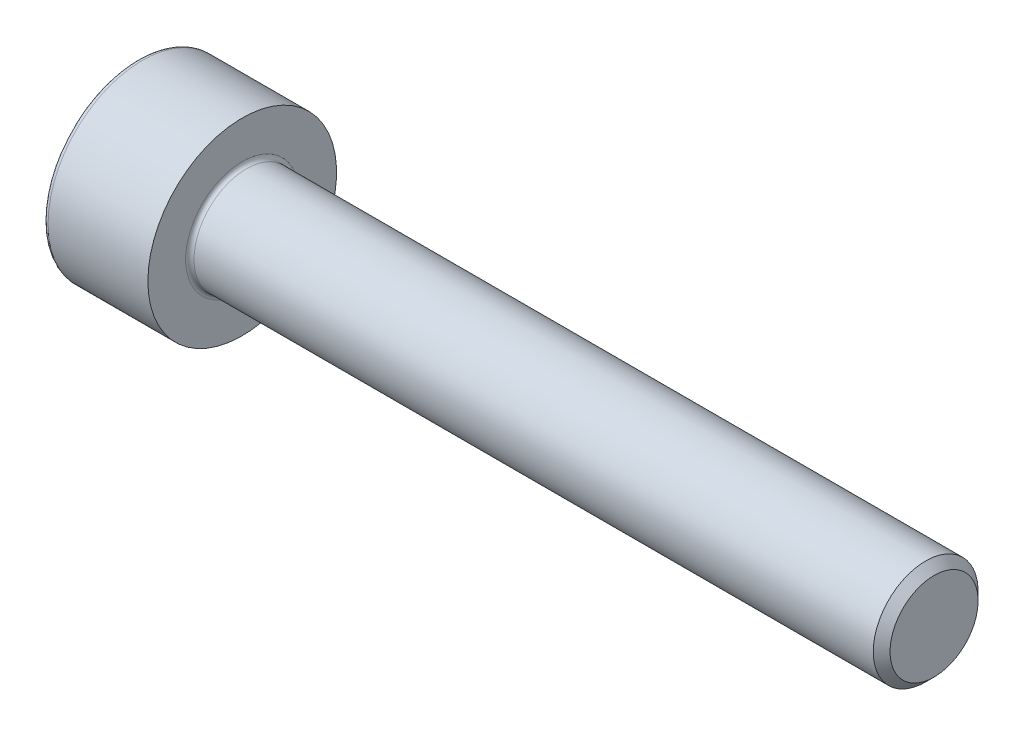
ISO-10303-21;
HEADER;
FILE_DESCRIPTION(('STEP AP214'),'2;1');
FILE_NAME('part.step','',(''),(''),'','','');
FILE_SCHEMA(('AUTOMOTIVE_DESIGN { 1 0 10303 214 1 1 1 1 }'));
ENDSEC;
DATA;
#1=APPLICATION_CONTEXT('core data for automotive mechanical design processes');
#2=APPLICATION_PROTOCOL_DEFINITION('international standard','automotive_design',2000,#1);
#3=PRODUCT_CONTEXT('',#1,'mechanical');
#4=PRODUCT('Part','Part','',(#3));
#5=PRODUCT_RELATED_PRODUCT_CATEGORY('part','',(#4));
#6=PRODUCT_DEFINITION_FORMATION('','',#4);
#7=PRODUCT_DEFINITION_CONTEXT('part definition',#1,'design');
#8=PRODUCT_DEFINITION('design','',#6,#7);
#9=PRODUCT_DEFINITION_SHAPE('','',#8);
#10=(LENGTH_UNIT() NAMED_UNIT(*) SI_UNIT(.MILLI.,.METRE.));
#11=(NAMED_UNIT(*) PLANE_ANGLE_UNIT() SI_UNIT($,.RADIAN.));
#12=(NAMED_UNIT(*) SI_UNIT($,.STERADIAN.) SOLID_ANGLE_UNIT());
#13=UNCERTAINTY_MEASURE_WITH_UNIT(LENGTH_MEASURE(1.E-05),#10,'distance_accuracy_value','');
#14=(GEOMETRIC_REPRESENTATION_CONTEXT(3) GLOBAL_UNCERTAINTY_ASSIGNED_CONTEXT((#13)) GLOBAL_UNIT_ASSIGNED_CONTEXT((#10,
#11,#12)) REPRESENTATION_CONTEXT('',''));
#15=CARTESIAN_POINT('',(0.,0.,0.));
#16=DIRECTION('',(0.,0.,1.));
#17=DIRECTION('',(1.,0.,0.));
#18=AXIS2_PLACEMENT_3D('',#15,#16,#17);
#19=CARTESIAN_POINT('',(19.,0.,0.));
#20=DIRECTION('',(-1.,0.,0.));
#21=DIRECTION('',(0.,0.,1.));
#22=AXIS2_PLACEMENT_3D('',#19,#20,#21);
#23=PLANE('',#22);
#24=CARTESIAN_POINT('',(19.,0.,0.));
#25=DIRECTION('',(-1.,0.,0.));
#26=DIRECTION('',(0.,0.,1.));
#27=AXIS2_PLACEMENT_3D('',#24,#25,#26);
#28=CIRCLE('',#27,1.05);
#29=CARTESIAN_POINT('',(19.,0.,1.05));
#30=VERTEX_POINT('',#29);
#31=EDGE_CURVE('E11',#30,#30,#28,.F.);
#32=ORIENTED_EDGE('',*,*,#31,.T.);
#33=EDGE_LOOP('',(#32));
#34=FACE_BOUND('',#33,.T.);
#35=ADVANCED_FACE('F37',(#34),#23,.F.);
#36=CARTESIAN_POINT('',(0.,0.,0.));
#37=DIRECTION('',(-1.,0.,0.));
#38=DIRECTION('',(0.,0.,1.));
#39=AXIS2_PLACEMENT_3D('',#36,#37,#38);
#40=CYLINDRICAL_SURFACE('',#39,1.25);
#41=CARTESIAN_POINT('',(18.8,0.,0.));
#42=DIRECTION('',(-1.,0.,0.));
#43=DIRECTION('',(0.,0.,1.));
#44=AXIS2_PLACEMENT_3D('',#41,#42,#43);
#45=CIRCLE('',#44,1.25);
#46=CARTESIAN_POINT('',(18.8,0.,1.25));
#47=VERTEX_POINT('',#46);
#48=EDGE_CURVE('E45',#47,#47,#45,.T.);
#49=ORIENTED_EDGE('',*,*,#48,.T.);
#50=EDGE_LOOP('',(#49));
#51=FACE_BOUND('',#50,.T.);
#52=CARTESIAN_POINT('',(2.6,0.,0.));
#53=DIRECTION('',(1.,0.,0.));
#54=DIRECTION('',(0.,0.,-1.));
#55=AXIS2_PLACEMENT_3D('',#52,#53,#54);
#56=CIRCLE('',#55,1.25);
#57=CARTESIAN_POINT('',(2.6,0.,-1.25));
#58=VERTEX_POINT('',#57);
#59=EDGE_CURVE('E150',#58,#58,#56,.T.);
#60=ORIENTED_EDGE('',*,*,#59,.T.);
#61=EDGE_LOOP('',(#60));
#62=FACE_BOUND('',#61,.T.);
#63=ADVANCED_FACE('F161',(#51,#62),#40,.T.);
#64=CARTESIAN_POINT('',(2.5,0.,0.));
#65=DIRECTION('',(1.,0.,0.));
#66=DIRECTION('',(0.,0.,-1.));
#67=AXIS2_PLACEMENT_3D('',#64,#65,#66);
#68=PLANE('',#67);
#69=CARTESIAN_POINT('',(2.5,0.,0.));
#70=DIRECTION('',(1.,0.,0.));
#71=DIRECTION('',(0.,0.,-1.));
#72=AXIS2_PLACEMENT_3D('',#69,#70,#71);
#73=CIRCLE('',#72,1.35);
#74=CARTESIAN_POINT('',(2.5,0.,-1.35));
#75=VERTEX_POINT('',#74);
#76=EDGE_CURVE('E147',#75,#75,#73,.F.);
#77=ORIENTED_EDGE('',*,*,#76,.T.);
#78=EDGE_LOOP('',(#77));
#79=FACE_BOUND('',#78,.T.);
#80=CARTESIAN_POINT('',(2.5,0.,0.));
#81=DIRECTION('',(-1.,0.,0.));
#82=DIRECTION('',(0.,0.,1.));
#83=AXIS2_PLACEMENT_3D('',#80,#81,#82);
#84=CIRCLE('',#83,2.25);
#85=CARTESIAN_POINT('',(2.5,0.,2.25));
#86=VERTEX_POINT('',#85);
#87=EDGE_CURVE('E139',#86,#86,#84,.T.);
#88=ORIENTED_EDGE('',*,*,#87,.F.);
#89=EDGE_LOOP('',(#88));
#90=FACE_BOUND('',#89,.T.);
#91=ADVANCED_FACE('F183',(#79,#90),#68,.T.);
#92=CARTESIAN_POINT('',(0.,0.,0.));
#93=DIRECTION('',(-1.,0.,0.));
#94=DIRECTION('',(0.,0.,1.));
#95=AXIS2_PLACEMENT_3D('',#92,#93,#94);
#96=CYLINDRICAL_SURFACE('',#95,2.25);
#97=CARTESIAN_POINT('',(0.12,0.,0.));
#98=DIRECTION('',(-1.,0.,0.));
#99=DIRECTION('',(0.,0.,1.));
#100=AXIS2_PLACEMENT_3D('',#97,#98,#99);
#101=CIRCLE('',#100,2.25);
#102=CARTESIAN_POINT('',(0.12,0.,2.25));
#103=VERTEX_POINT('',#102);
#104=EDGE_CURVE('E156',#103,#103,#101,.F.);
#105=ORIENTED_EDGE('',*,*,#104,.T.);
#106=EDGE_LOOP('',(#105));
#107=FACE_BOUND('',#106,.T.);
#108=ORIENTED_EDGE('',*,*,#87,.T.);
#109=EDGE_LOOP('',(#108));
#110=FACE_BOUND('',#109,.T.);
#111=ADVANCED_FACE('F193',(#107,#110),#96,.T.);
#112=CARTESIAN_POINT('',(0.,0.,0.));
#113=DIRECTION('',(-1.,0.,0.));
#114=DIRECTION('',(0.,0.,1.));
#115=AXIS2_PLACEMENT_3D('',#112,#113,#114);
#116=PLANE('',#115);
#117=DIRECTION('',(0.,0.5,-0.866025403784439));
#118=VECTOR('',#117,1.);
#119=CARTESIAN_POINT('',(0.,0.577350269189626,1.));
#120=LINE('',#119,#118);
#121=CARTESIAN_POINT('',(0.,0.577350269189626,1.));
#122=VERTEX_POINT('',#121);
#123=CARTESIAN_POINT('',(0.,1.15470053837925,0.));
#124=VERTEX_POINT('',#123);
#125=EDGE_CURVE('E52',#122,#124,#120,.T.);
#126=ORIENTED_EDGE('',*,*,#125,.F.);
#127=DIRECTION('',(0.,1.,0.));
#128=VECTOR('',#127,1.);
#129=CARTESIAN_POINT('',(0.,-0.577350269189626,1.));
#130=LINE('',#129,#128);
#131=CARTESIAN_POINT('',(0.,-0.577350269189626,1.));
#132=VERTEX_POINT('',#131);
#133=EDGE_CURVE('E135',#132,#122,#130,.T.);
#134=ORIENTED_EDGE('',*,*,#133,.F.);
#135=DIRECTION('',(0.,0.5,0.866025403784439));
#136=VECTOR('',#135,1.);
#137=CARTESIAN_POINT('',(0.,-1.15470053837925,0.));
#138=LINE('',#137,#136);
#139=CARTESIAN_POINT('',(0.,-1.15470053837925,0.));
#140=VERTEX_POINT('',#139);
#141=EDGE_CURVE('E133',#140,#132,#138,.T.);
#142=ORIENTED_EDGE('',*,*,#141,.F.);
#143=DIRECTION('',(0.,-0.5,0.866025403784439));
#144=VECTOR('',#143,1.);
#145=CARTESIAN_POINT('',(0.,-0.577350269189626,-1.));
#146=LINE('',#145,#144);
#147=CARTESIAN_POINT('',(0.,-0.577350269189626,-1.));
#148=VERTEX_POINT('',#147);
#149=EDGE_CURVE('E100',#148,#140,#146,.T.);
#150=ORIENTED_EDGE('',*,*,#149,.F.);
#151=DIRECTION('',(0.,-1.,0.));
#152=VECTOR('',#151,1.);
#153=CARTESIAN_POINT('',(0.,0.577350269189626,-1.));
#154=LINE('',#153,#152);
#155=CARTESIAN_POINT('',(0.,0.577350269189626,-1.));
#156=VERTEX_POINT('',#155);
#157=EDGE_CURVE('E129',#156,#148,#154,.T.);
#158=ORIENTED_EDGE('',*,*,#157,.F.);
#159=DIRECTION('',(0.,-0.5,-0.866025403784439));
#160=VECTOR('',#159,1.);
#161=CARTESIAN_POINT('',(0.,1.15470053837925,0.));
#162=LINE('',#161,#160);
#163=EDGE_CURVE('E126',#124,#156,#162,.T.);
#164=ORIENTED_EDGE('',*,*,#163,.F.);
#165=EDGE_LOOP('',(#126,#134,#142,#150,#158,#164));
#166=FACE_BOUND('',#165,.T.);
#167=CARTESIAN_POINT('',(0.,0.,0.));
#168=DIRECTION('',(-1.,0.,0.));
#169=DIRECTION('',(0.,0.,1.));
#170=AXIS2_PLACEMENT_3D('',#167,#168,#169);
#171=CIRCLE('',#170,2.13);
#172=CARTESIAN_POINT('',(0.,0.,2.13));
#173=VERTEX_POINT('',#172);
#174=EDGE_CURVE('E153',#173,#173,#171,.T.);
#175=ORIENTED_EDGE('',*,*,#174,.T.);
#176=EDGE_LOOP('',(#175));
#177=FACE_BOUND('',#176,.T.);
#178=ADVANCED_FACE('F188',(#166,#177),#116,.T.);
#179=CARTESIAN_POINT('',(2.6,0.,0.));
#180=DIRECTION('',(1.,0.,0.));
#181=DIRECTION('',(0.,0.,-1.));
#182=AXIS2_PLACEMENT_3D('',#179,#180,#181);
#183=TOROIDAL_SURFACE('',#182,1.35,0.1);
#184=ORIENTED_EDGE('',*,*,#59,.F.);
#185=EDGE_LOOP('',(#184));
#186=FACE_BOUND('',#185,.T.);
#187=ORIENTED_EDGE('',*,*,#76,.F.);
#188=EDGE_LOOP('',(#187));
#189=FACE_BOUND('',#188,.T.);
#190=ADVANCED_FACE('F174',(#186,#189),#183,.F.);
#191=CARTESIAN_POINT('',(0.12,0.,0.));
#192=DIRECTION('',(-1.,0.,0.));
#193=DIRECTION('',(0.,0.,1.));
#194=AXIS2_PLACEMENT_3D('',#191,#192,#193);
#195=TOROIDAL_SURFACE('',#194,2.13,0.12);
#196=ORIENTED_EDGE('',*,*,#104,.F.);
#197=EDGE_LOOP('',(#196));
#198=FACE_BOUND('',#197,.T.);
#199=ORIENTED_EDGE('',*,*,#174,.F.);
#200=EDGE_LOOP('',(#199));
#201=FACE_BOUND('',#200,.T.);
#202=ADVANCED_FACE('F166',(#198,#201),#195,.T.);
#203=CARTESIAN_POINT('',(18.8,0.,0.));
#204=DIRECTION('',(-1.,0.,0.));
#205=DIRECTION('',(0.,0.,1.));
#206=AXIS2_PLACEMENT_3D('',#203,#204,#205);
#207=CONICAL_SURFACE('',#206,1.25,0.785398163397456);
#208=ORIENTED_EDGE('',*,*,#31,.F.);
#209=EDGE_LOOP('',(#208));
#210=FACE_BOUND('',#209,.T.);
#211=ORIENTED_EDGE('',*,*,#48,.F.);
#212=EDGE_LOOP('',(#211));
#213=FACE_BOUND('',#212,.T.);
#214=ADVANCED_FACE('F39',(#210,#213),#207,.T.);
#215=CARTESIAN_POINT('',(1.,0.577350269189626,1.));
#216=DIRECTION('',(0.,0.866025403784439,0.5));
#217=DIRECTION('',(0.,-0.5,0.866025403784439));
#218=AXIS2_PLACEMENT_3D('',#215,#216,#217);
#219=PLANE('',#218);
#220=ORIENTED_EDGE('',*,*,#125,.T.);
#221=DIRECTION('',(-1.,0.,0.));
#222=VECTOR('',#221,1.);
#223=CARTESIAN_POINT('',(1.,1.15470053837925,0.));
#224=LINE('',#223,#222);
#225=CARTESIAN_POINT('',(1.,1.15470053837925,0.));
#226=VERTEX_POINT('',#225);
#227=EDGE_CURVE('E82',#226,#124,#224,.T.);
#228=ORIENTED_EDGE('',*,*,#227,.F.);
#229=DIRECTION('',(0.,0.5,-0.866025403784439));
#230=VECTOR('',#229,1.);
#231=CARTESIAN_POINT('',(1.,0.577350269189626,1.));
#232=LINE('',#231,#230);
#233=CARTESIAN_POINT('',(1.,0.577350269189626,1.));
#234=VERTEX_POINT('',#233);
#235=EDGE_CURVE('E137',#234,#226,#232,.T.);
#236=ORIENTED_EDGE('',*,*,#235,.F.);
#237=DIRECTION('',(-1.,0.,0.));
#238=VECTOR('',#237,1.);
#239=CARTESIAN_POINT('',(1.,0.577350269189626,1.));
#240=LINE('',#239,#238);
#241=EDGE_CURVE('E60',#234,#122,#240,.T.);
#242=ORIENTED_EDGE('',*,*,#241,.T.);
#243=EDGE_LOOP('',(#220,#228,#236,#242));
#244=FACE_BOUND('',#243,.T.);
#245=ADVANCED_FACE('F165',(#244),#219,.F.);
#246=CARTESIAN_POINT('',(1.,-0.577350269189626,1.));
#247=DIRECTION('',(0.,0.,1.));
#248=DIRECTION('',(0.,-1.,0.));
#249=AXIS2_PLACEMENT_3D('',#246,#247,#248);
#250=PLANE('',#249);
#251=ORIENTED_EDGE('',*,*,#133,.T.);
#252=ORIENTED_EDGE('',*,*,#241,.F.);
#253=DIRECTION('',(0.,1.,0.));
#254=VECTOR('',#253,1.);
#255=CARTESIAN_POINT('',(1.,-0.577350269189626,1.));
#256=LINE('',#255,#254);
#257=CARTESIAN_POINT('',(1.,-0.577350269189626,1.));
#258=VERTEX_POINT('',#257);
#259=EDGE_CURVE('E112',#258,#234,#256,.T.);
#260=ORIENTED_EDGE('',*,*,#259,.F.);
#261=DIRECTION('',(-1.,0.,0.));
#262=VECTOR('',#261,1.);
#263=CARTESIAN_POINT('',(1.,-0.577350269189626,1.));
#264=LINE('',#263,#262);
#265=EDGE_CURVE('E104',#258,#132,#264,.T.);
#266=ORIENTED_EDGE('',*,*,#265,.T.);
#267=EDGE_LOOP('',(#251,#252,#260,#266));
#268=FACE_BOUND('',#267,.T.);
#269=ADVANCED_FACE('F172',(#268),#250,.F.);
#270=CARTESIAN_POINT('',(1.,-1.15470053837925,0.));
#271=DIRECTION('',(0.,-0.866025403784439,0.5));
#272=DIRECTION('',(0.,-0.5,-0.866025403784439));
#273=AXIS2_PLACEMENT_3D('',#270,#271,#272);
#274=PLANE('',#273);
#275=ORIENTED_EDGE('',*,*,#141,.T.);
#276=ORIENTED_EDGE('',*,*,#265,.F.);
#277=DIRECTION('',(0.,0.5,0.866025403784439));
#278=VECTOR('',#277,1.);
#279=CARTESIAN_POINT('',(1.,-1.15470053837925,0.));
#280=LINE('',#279,#278);
#281=CARTESIAN_POINT('',(1.,-1.15470053837925,0.));
#282=VERTEX_POINT('',#281);
#283=EDGE_CURVE('E108',#282,#258,#280,.T.);
#284=ORIENTED_EDGE('',*,*,#283,.F.);
#285=DIRECTION('',(-1.,0.,0.));
#286=VECTOR('',#285,1.);
#287=CARTESIAN_POINT('',(1.,-1.15470053837925,0.));
#288=LINE('',#287,#286);
#289=EDGE_CURVE('E93',#282,#140,#288,.T.);
#290=ORIENTED_EDGE('',*,*,#289,.T.);
#291=EDGE_LOOP('',(#275,#276,#284,#290));
#292=FACE_BOUND('',#291,.T.);
#293=ADVANCED_FACE('F109',(#292),#274,.F.);
#294=CARTESIAN_POINT('',(1.,-0.577350269189626,-1.));
#295=DIRECTION('',(0.,-0.866025403784439,-0.5));
#296=DIRECTION('',(0.,0.5,-0.866025403784439));
#297=AXIS2_PLACEMENT_3D('',#294,#295,#296);
#298=PLANE('',#297);
#299=ORIENTED_EDGE('',*,*,#149,.T.);
#300=ORIENTED_EDGE('',*,*,#289,.F.);
#301=DIRECTION('',(0.,-0.5,0.866025403784439));
#302=VECTOR('',#301,1.);
#303=CARTESIAN_POINT('',(1.,-0.577350269189626,-1.));
#304=LINE('',#303,#302);
#305=CARTESIAN_POINT('',(1.,-0.577350269189626,-1.));
#306=VERTEX_POINT('',#305);
#307=EDGE_CURVE('E97',#306,#282,#304,.T.);
#308=ORIENTED_EDGE('',*,*,#307,.F.);
#309=DIRECTION('',(-1.,0.,0.));
#310=VECTOR('',#309,1.);
#311=CARTESIAN_POINT('',(1.,-0.577350269189626,-1.));
#312=LINE('',#311,#310);
#313=EDGE_CURVE('E105',#306,#148,#312,.T.);
#314=ORIENTED_EDGE('',*,*,#313,.T.);
#315=EDGE_LOOP('',(#299,#300,#308,#314));
#316=FACE_BOUND('',#315,.T.);
#317=ADVANCED_FACE('F95',(#316),#298,.F.);
#318=CARTESIAN_POINT('',(1.,0.577350269189626,-1.));
#319=DIRECTION('',(0.,0.,-1.));
#320=DIRECTION('',(0.,1.,0.));
#321=AXIS2_PLACEMENT_3D('',#318,#319,#320);
#322=PLANE('',#321);
#323=ORIENTED_EDGE('',*,*,#157,.T.);
#324=ORIENTED_EDGE('',*,*,#313,.F.);
#325=DIRECTION('',(0.,-1.,0.));
#326=VECTOR('',#325,1.);
#327=CARTESIAN_POINT('',(1.,0.577350269189626,-1.));
#328=LINE('',#327,#326);
#329=CARTESIAN_POINT('',(1.,0.577350269189626,-1.));
#330=VERTEX_POINT('',#329);
#331=EDGE_CURVE('E118',#330,#306,#328,.T.);
#332=ORIENTED_EDGE('',*,*,#331,.F.);
#333=DIRECTION('',(-1.,0.,0.));
#334=VECTOR('',#333,1.);
#335=CARTESIAN_POINT('',(1.,0.577350269189626,-1.));
#336=LINE('',#335,#334);
#337=EDGE_CURVE('E142',#330,#156,#336,.T.);
#338=ORIENTED_EDGE('',*,*,#337,.T.);
#339=EDGE_LOOP('',(#323,#324,#332,#338));
#340=FACE_BOUND('',#339,.T.);
#341=ADVANCED_FACE('F213',(#340),#322,.F.);
#342=CARTESIAN_POINT('',(1.,1.15470053837925,0.));
#343=DIRECTION('',(0.,0.866025403784439,-0.5));
#344=DIRECTION('',(0.,0.5,0.866025403784439));
#345=AXIS2_PLACEMENT_3D('',#342,#343,#344);
#346=PLANE('',#345);
#347=ORIENTED_EDGE('',*,*,#163,.T.);
#348=ORIENTED_EDGE('',*,*,#337,.F.);
#349=DIRECTION('',(0.,-0.5,-0.866025403784439));
#350=VECTOR('',#349,1.);
#351=CARTESIAN_POINT('',(1.,1.15470053837925,0.));
#352=LINE('',#351,#350);
#353=EDGE_CURVE('E120',#226,#330,#352,.T.);
#354=ORIENTED_EDGE('',*,*,#353,.F.);
#355=ORIENTED_EDGE('',*,*,#227,.T.);
#356=EDGE_LOOP('',(#347,#348,#354,#355));
#357=FACE_BOUND('',#356,.T.);
#358=ADVANCED_FACE('F210',(#357),#346,.F.);
#359=CARTESIAN_POINT('',(1.,0.,0.));
#360=DIRECTION('',(-1.,0.,0.));
#361=DIRECTION('',(0.,0.,1.));
#362=AXIS2_PLACEMENT_3D('',#359,#360,#361);
#363=PLANE('',#362);
#364=ORIENTED_EDGE('',*,*,#235,.T.);
#365=ORIENTED_EDGE('',*,*,#353,.T.);
#366=ORIENTED_EDGE('',*,*,#331,.T.);
#367=ORIENTED_EDGE('',*,*,#307,.T.);
#368=ORIENTED_EDGE('',*,*,#283,.T.);
#369=ORIENTED_EDGE('',*,*,#259,.T.);
#370=EDGE_LOOP('',(#364,#365,#366,#367,#368,#369));
#371=FACE_BOUND('',#370,.T.);
#372=ADVANCED_FACE('F115',(#371),#363,.T.);
#373=CLOSED_SHELL('',(#35,#63,#91,#111,#178,#190,#202,#214,#245,#269,#293,#317,#341,#358,#372));
#374=MANIFOLD_SOLID_BREP('B2',#373);
#375=ADVANCED_BREP_SHAPE_REPRESENTATION('',(#18,#374),#14);
#376=SHAPE_DEFINITION_REPRESENTATION(#9,#375);
ENDSEC;
END-ISO-10303-21;
